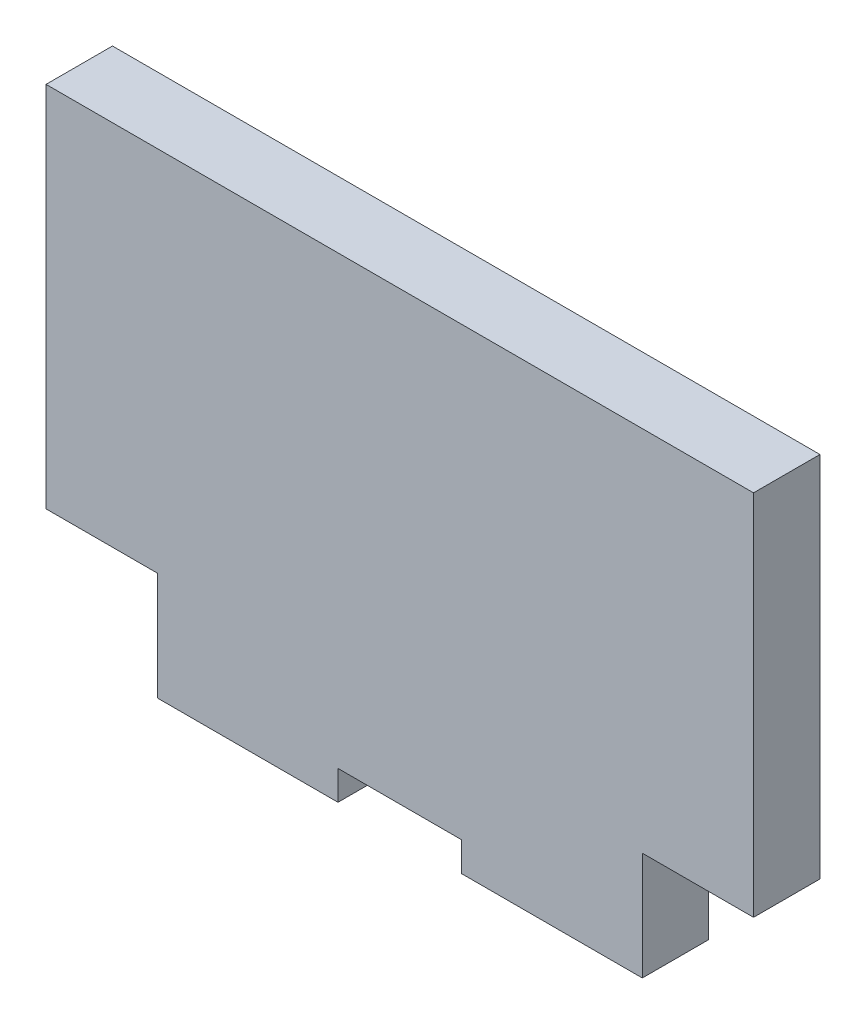
ISO-10303-21;
HEADER;
FILE_DESCRIPTION(('STEP AP214'),'2;1');
FILE_NAME('part.step','',(''),(''),'','','');
FILE_SCHEMA(('AUTOMOTIVE_DESIGN { 1 0 10303 214 1 1 1 1 }'));
ENDSEC;
DATA;
#1=APPLICATION_CONTEXT('core data for automotive mechanical design processes');
#2=APPLICATION_PROTOCOL_DEFINITION('international standard','automotive_design',2000,#1);
#3=PRODUCT_CONTEXT('',#1,'mechanical');
#4=PRODUCT('Part','Part','',(#3));
#5=PRODUCT_RELATED_PRODUCT_CATEGORY('part','',(#4));
#6=PRODUCT_DEFINITION_FORMATION('','',#4);
#7=PRODUCT_DEFINITION_CONTEXT('part definition',#1,'design');
#8=PRODUCT_DEFINITION('design','',#6,#7);
#9=PRODUCT_DEFINITION_SHAPE('','',#8);
#10=(LENGTH_UNIT() NAMED_UNIT(*) SI_UNIT(.MILLI.,.METRE.));
#11=(NAMED_UNIT(*) PLANE_ANGLE_UNIT() SI_UNIT($,.RADIAN.));
#12=(NAMED_UNIT(*) SI_UNIT($,.STERADIAN.) SOLID_ANGLE_UNIT());
#13=UNCERTAINTY_MEASURE_WITH_UNIT(LENGTH_MEASURE(1.E-05),#10,'distance_accuracy_value','');
#14=(GEOMETRIC_REPRESENTATION_CONTEXT(3) GLOBAL_UNCERTAINTY_ASSIGNED_CONTEXT((#13)) GLOBAL_UNIT_ASSIGNED_CONTEXT((#10,
#11,#12)) REPRESENTATION_CONTEXT('',''));
#15=CARTESIAN_POINT('',(0.,0.,0.));
#16=DIRECTION('',(0.,0.,1.));
#17=DIRECTION('',(1.,0.,0.));
#18=AXIS2_PLACEMENT_3D('',#15,#16,#17);
#19=CARTESIAN_POINT('',(-4.,-13.5,-4.3));
#20=DIRECTION('',(0.,1.,0.));
#21=DIRECTION('',(0.,0.,1.));
#22=AXIS2_PLACEMENT_3D('',#19,#20,#21);
#23=PLANE('',#22);
#24=DIRECTION('',(-1.,0.,0.));
#25=VECTOR('',#24,1.);
#26=CARTESIAN_POINT('',(5.5,-13.5,-1.));
#27=LINE('',#26,#25);
#28=CARTESIAN_POINT('',(4.,-13.5,-1.));
#29=VERTEX_POINT('',#28);
#30=CARTESIAN_POINT('',(-4.,-13.5,-1.));
#31=VERTEX_POINT('',#30);
#32=EDGE_CURVE('E443',#29,#31,#27,.T.);
#33=ORIENTED_EDGE('',*,*,#32,.F.);
#34=DIRECTION('',(0.,0.,1.));
#35=VECTOR('',#34,1.);
#36=CARTESIAN_POINT('',(4.,-13.5,-4.3));
#37=LINE('',#36,#35);
#38=CARTESIAN_POINT('',(4.,-13.5,0.));
#39=VERTEX_POINT('',#38);
#40=EDGE_CURVE('E195',#29,#39,#37,.T.);
#41=ORIENTED_EDGE('',*,*,#40,.T.);
#42=DIRECTION('',(-1.,0.,0.));
#43=VECTOR('',#42,1.);
#44=CARTESIAN_POINT('',(-4.,-13.5,0.));
#45=LINE('',#44,#43);
#46=CARTESIAN_POINT('',(-4.,-13.5,0.));
#47=VERTEX_POINT('',#46);
#48=EDGE_CURVE('E189',#39,#47,#45,.T.);
#49=ORIENTED_EDGE('',*,*,#48,.T.);
#50=DIRECTION('',(0.,0.,1.));
#51=VECTOR('',#50,1.);
#52=CARTESIAN_POINT('',(-4.,-13.5,-4.3));
#53=LINE('',#52,#51);
#54=EDGE_CURVE('E469',#31,#47,#53,.T.);
#55=ORIENTED_EDGE('',*,*,#54,.F.);
#56=EDGE_LOOP('',(#33,#41,#49,#55));
#57=FACE_BOUND('',#56,.T.);
#58=ADVANCED_FACE('F33',(#57),#23,.F.);
#59=CARTESIAN_POINT('',(4.,-15.4,-4.3));
#60=DIRECTION('',(0.,-1.,0.));
#61=DIRECTION('',(0.,0.,-1.));
#62=AXIS2_PLACEMENT_3D('',#59,#60,#61);
#63=PLANE('',#62);
#64=DIRECTION('',(0.,0.,-1.));
#65=VECTOR('',#64,1.);
#66=CARTESIAN_POINT('',(-4.,-15.4,-4.3));
#67=LINE('',#66,#65);
#68=CARTESIAN_POINT('',(-4.,-15.4,0.));
#69=VERTEX_POINT('',#68);
#70=CARTESIAN_POINT('',(-4.,-15.4,-4.3));
#71=VERTEX_POINT('',#70);
#72=EDGE_CURVE('E150',#69,#71,#67,.T.);
#73=ORIENTED_EDGE('',*,*,#72,.F.);
#74=DIRECTION('',(1.,0.,0.));
#75=VECTOR('',#74,1.);
#76=CARTESIAN_POINT('',(4.,-15.4,0.));
#77=LINE('',#76,#75);
#78=CARTESIAN_POINT('',(-15.7,-15.4,0.));
#79=VERTEX_POINT('',#78);
#80=EDGE_CURVE('E165',#79,#69,#77,.T.);
#81=ORIENTED_EDGE('',*,*,#80,.F.);
#82=DIRECTION('',(0.,0.,1.));
#83=VECTOR('',#82,1.);
#84=CARTESIAN_POINT('',(-15.7,-15.4,-4.3));
#85=LINE('',#84,#83);
#86=CARTESIAN_POINT('',(-15.7,-15.4,-4.3));
#87=VERTEX_POINT('',#86);
#88=EDGE_CURVE('E41',#87,#79,#85,.T.);
#89=ORIENTED_EDGE('',*,*,#88,.F.);
#90=DIRECTION('',(1.,0.,0.));
#91=VECTOR('',#90,1.);
#92=CARTESIAN_POINT('',(15.7,-15.4,-4.3));
#93=LINE('',#92,#91);
#94=EDGE_CURVE('E56',#87,#71,#93,.T.);
#95=ORIENTED_EDGE('',*,*,#94,.T.);
#96=EDGE_LOOP('',(#73,#81,#89,#95));
#97=FACE_BOUND('',#96,.T.);
#98=ADVANCED_FACE('F228',(#97),#63,.T.);
#99=DIRECTION('',(0.,0.,1.));
#100=VECTOR('',#99,1.);
#101=CARTESIAN_POINT('',(4.,-15.4,-4.3));
#102=LINE('',#101,#100);
#103=CARTESIAN_POINT('',(4.,-15.4,-4.3));
#104=VERTEX_POINT('',#103);
#105=CARTESIAN_POINT('',(4.,-15.4,0.));
#106=VERTEX_POINT('',#105);
#107=EDGE_CURVE('E48',#104,#106,#102,.T.);
#108=ORIENTED_EDGE('',*,*,#107,.F.);
#109=CARTESIAN_POINT('',(15.7,-15.4,-4.3));
#110=VERTEX_POINT('',#109);
#111=EDGE_CURVE('E97',#104,#110,#93,.T.);
#112=ORIENTED_EDGE('',*,*,#111,.T.);
#113=DIRECTION('',(0.,0.,1.));
#114=VECTOR('',#113,1.);
#115=CARTESIAN_POINT('',(15.7,-15.4,-4.3));
#116=LINE('',#115,#114);
#117=CARTESIAN_POINT('',(15.7,-15.4,0.));
#118=VERTEX_POINT('',#117);
#119=EDGE_CURVE('E145',#110,#118,#116,.T.);
#120=ORIENTED_EDGE('',*,*,#119,.T.);
#121=EDGE_CURVE('E164',#106,#118,#77,.T.);
#122=ORIENTED_EDGE('',*,*,#121,.F.);
#123=EDGE_LOOP('',(#108,#112,#120,#122));
#124=FACE_BOUND('',#123,.T.);
#125=ADVANCED_FACE('F178',(#124),#63,.T.);
#126=CARTESIAN_POINT('',(-15.7,-15.4,-4.3));
#127=DIRECTION('',(-1.,0.,0.));
#128=DIRECTION('',(0.,0.,1.));
#129=AXIS2_PLACEMENT_3D('',#126,#127,#128);
#130=PLANE('',#129);
#131=DIRECTION('',(0.,-1.,0.));
#132=VECTOR('',#131,1.);
#133=CARTESIAN_POINT('',(-15.7,-15.4,0.));
#134=LINE('',#133,#132);
#135=CARTESIAN_POINT('',(-15.7,-8.4,0.));
#136=VERTEX_POINT('',#135);
#137=EDGE_CURVE('E162',#136,#79,#134,.T.);
#138=ORIENTED_EDGE('',*,*,#137,.F.);
#139=DIRECTION('',(0.,0.,1.));
#140=VECTOR('',#139,1.);
#141=CARTESIAN_POINT('',(-15.7,-8.4,-4.3));
#142=LINE('',#141,#140);
#143=CARTESIAN_POINT('',(-15.7,-8.4,-4.3));
#144=VERTEX_POINT('',#143);
#145=EDGE_CURVE('E126',#144,#136,#142,.T.);
#146=ORIENTED_EDGE('',*,*,#145,.F.);
#147=DIRECTION('',(0.,-1.,0.));
#148=VECTOR('',#147,1.);
#149=CARTESIAN_POINT('',(-15.7,-15.4,-4.3));
#150=LINE('',#149,#148);
#151=EDGE_CURVE('E135',#144,#87,#150,.T.);
#152=ORIENTED_EDGE('',*,*,#151,.T.);
#153=ORIENTED_EDGE('',*,*,#88,.T.);
#154=EDGE_LOOP('',(#138,#146,#152,#153));
#155=FACE_BOUND('',#154,.T.);
#156=ADVANCED_FACE('F275',(#155),#130,.T.);
#157=CARTESIAN_POINT('',(-15.7,-8.4,-4.3));
#158=DIRECTION('',(0.,-1.,0.));
#159=DIRECTION('',(0.,0.,-1.));
#160=AXIS2_PLACEMENT_3D('',#157,#158,#159);
#161=PLANE('',#160);
#162=DIRECTION('',(1.,0.,0.));
#163=VECTOR('',#162,1.);
#164=CARTESIAN_POINT('',(-15.7,-8.4,0.));
#165=LINE('',#164,#163);
#166=CARTESIAN_POINT('',(-22.9,-8.4,0.));
#167=VERTEX_POINT('',#166);
#168=EDGE_CURVE('E121',#167,#136,#165,.T.);
#169=ORIENTED_EDGE('',*,*,#168,.F.);
#170=DIRECTION('',(0.,0.,1.));
#171=VECTOR('',#170,1.);
#172=CARTESIAN_POINT('',(-22.9,-8.4,-4.3));
#173=LINE('',#172,#171);
#174=CARTESIAN_POINT('',(-22.9,-8.4,-4.3));
#175=VERTEX_POINT('',#174);
#176=EDGE_CURVE('E116',#175,#167,#173,.T.);
#177=ORIENTED_EDGE('',*,*,#176,.F.);
#178=DIRECTION('',(1.,0.,0.));
#179=VECTOR('',#178,1.);
#180=CARTESIAN_POINT('',(-15.7,-8.4,-4.3));
#181=LINE('',#180,#179);
#182=EDGE_CURVE('E119',#175,#144,#181,.T.);
#183=ORIENTED_EDGE('',*,*,#182,.T.);
#184=ORIENTED_EDGE('',*,*,#145,.T.);
#185=EDGE_LOOP('',(#169,#177,#183,#184));
#186=FACE_BOUND('',#185,.T.);
#187=ADVANCED_FACE('F118',(#186),#161,.T.);
#188=CARTESIAN_POINT('',(-22.9,-8.4,-4.3));
#189=DIRECTION('',(-1.,0.,0.));
#190=DIRECTION('',(0.,0.,1.));
#191=AXIS2_PLACEMENT_3D('',#188,#189,#190);
#192=PLANE('',#191);
#193=DIRECTION('',(0.,-1.,0.));
#194=VECTOR('',#193,1.);
#195=CARTESIAN_POINT('',(-22.9,-8.4,0.));
#196=LINE('',#195,#194);
#197=CARTESIAN_POINT('',(-22.9,15.4,0.));
#198=VERTEX_POINT('',#197);
#199=EDGE_CURVE('E159',#198,#167,#196,.T.);
#200=ORIENTED_EDGE('',*,*,#199,.F.);
#201=DIRECTION('',(0.,0.,1.));
#202=VECTOR('',#201,1.);
#203=CARTESIAN_POINT('',(-22.9,15.4,-4.3));
#204=LINE('',#203,#202);
#205=CARTESIAN_POINT('',(-22.9,15.4,-4.3));
#206=VERTEX_POINT('',#205);
#207=EDGE_CURVE('E127',#206,#198,#204,.T.);
#208=ORIENTED_EDGE('',*,*,#207,.F.);
#209=DIRECTION('',(0.,-1.,0.));
#210=VECTOR('',#209,1.);
#211=CARTESIAN_POINT('',(-22.9,-8.4,-4.3));
#212=LINE('',#211,#210);
#213=EDGE_CURVE('E133',#206,#175,#212,.T.);
#214=ORIENTED_EDGE('',*,*,#213,.T.);
#215=ORIENTED_EDGE('',*,*,#176,.T.);
#216=EDGE_LOOP('',(#200,#208,#214,#215));
#217=FACE_BOUND('',#216,.T.);
#218=ADVANCED_FACE('F137',(#217),#192,.T.);
#219=CARTESIAN_POINT('',(-22.9,15.4,-4.3));
#220=DIRECTION('',(0.,1.,0.));
#221=DIRECTION('',(0.,0.,1.));
#222=AXIS2_PLACEMENT_3D('',#219,#220,#221);
#223=PLANE('',#222);
#224=DIRECTION('',(-1.,0.,0.));
#225=VECTOR('',#224,1.);
#226=CARTESIAN_POINT('',(-22.9,15.4,0.));
#227=LINE('',#226,#225);
#228=CARTESIAN_POINT('',(22.9,15.4,0.));
#229=VERTEX_POINT('',#228);
#230=EDGE_CURVE('E156',#229,#198,#227,.T.);
#231=ORIENTED_EDGE('',*,*,#230,.F.);
#232=DIRECTION('',(0.,0.,1.));
#233=VECTOR('',#232,1.);
#234=CARTESIAN_POINT('',(22.9,15.4,-4.3));
#235=LINE('',#234,#233);
#236=CARTESIAN_POINT('',(22.9,15.4,-4.3));
#237=VERTEX_POINT('',#236);
#238=EDGE_CURVE('E171',#237,#229,#235,.T.);
#239=ORIENTED_EDGE('',*,*,#238,.F.);
#240=DIRECTION('',(-1.,0.,0.));
#241=VECTOR('',#240,1.);
#242=CARTESIAN_POINT('',(-22.9,15.4,-4.3));
#243=LINE('',#242,#241);
#244=EDGE_CURVE('E138',#237,#206,#243,.T.);
#245=ORIENTED_EDGE('',*,*,#244,.T.);
#246=ORIENTED_EDGE('',*,*,#207,.T.);
#247=EDGE_LOOP('',(#231,#239,#245,#246));
#248=FACE_BOUND('',#247,.T.);
#249=ADVANCED_FACE('F246',(#248),#223,.T.);
#250=CARTESIAN_POINT('',(22.9,15.4,-4.3));
#251=DIRECTION('',(1.,0.,0.));
#252=DIRECTION('',(0.,0.,-1.));
#253=AXIS2_PLACEMENT_3D('',#250,#251,#252);
#254=PLANE('',#253);
#255=DIRECTION('',(0.,1.,0.));
#256=VECTOR('',#255,1.);
#257=CARTESIAN_POINT('',(22.9,15.4,0.));
#258=LINE('',#257,#256);
#259=CARTESIAN_POINT('',(22.9,-8.4,0.));
#260=VERTEX_POINT('',#259);
#261=EDGE_CURVE('E153',#260,#229,#258,.T.);
#262=ORIENTED_EDGE('',*,*,#261,.F.);
#263=DIRECTION('',(0.,0.,1.));
#264=VECTOR('',#263,1.);
#265=CARTESIAN_POINT('',(22.9,-8.4,-4.3));
#266=LINE('',#265,#264);
#267=CARTESIAN_POINT('',(22.9,-8.4,-4.3));
#268=VERTEX_POINT('',#267);
#269=EDGE_CURVE('E173',#268,#260,#266,.T.);
#270=ORIENTED_EDGE('',*,*,#269,.F.);
#271=DIRECTION('',(0.,1.,0.));
#272=VECTOR('',#271,1.);
#273=CARTESIAN_POINT('',(22.9,15.4,-4.3));
#274=LINE('',#273,#272);
#275=EDGE_CURVE('E140',#268,#237,#274,.T.);
#276=ORIENTED_EDGE('',*,*,#275,.T.);
#277=ORIENTED_EDGE('',*,*,#238,.T.);
#278=EDGE_LOOP('',(#262,#270,#276,#277));
#279=FACE_BOUND('',#278,.T.);
#280=ADVANCED_FACE('F240',(#279),#254,.T.);
#281=CARTESIAN_POINT('',(22.9,-8.4,-4.3));
#282=DIRECTION('',(0.,-1.,0.));
#283=DIRECTION('',(0.,0.,-1.));
#284=AXIS2_PLACEMENT_3D('',#281,#282,#283);
#285=PLANE('',#284);
#286=DIRECTION('',(1.,0.,0.));
#287=VECTOR('',#286,1.);
#288=CARTESIAN_POINT('',(22.9,-8.4,0.));
#289=LINE('',#288,#287);
#290=CARTESIAN_POINT('',(15.7,-8.4,0.));
#291=VERTEX_POINT('',#290);
#292=EDGE_CURVE('E149',#291,#260,#289,.T.);
#293=ORIENTED_EDGE('',*,*,#292,.F.);
#294=DIRECTION('',(0.,0.,1.));
#295=VECTOR('',#294,1.);
#296=CARTESIAN_POINT('',(15.7,-8.4,-4.3));
#297=LINE('',#296,#295);
#298=CARTESIAN_POINT('',(15.7,-8.4,-4.3));
#299=VERTEX_POINT('',#298);
#300=EDGE_CURVE('E175',#299,#291,#297,.T.);
#301=ORIENTED_EDGE('',*,*,#300,.F.);
#302=DIRECTION('',(1.,0.,0.));
#303=VECTOR('',#302,1.);
#304=CARTESIAN_POINT('',(22.9,-8.4,-4.3));
#305=LINE('',#304,#303);
#306=EDGE_CURVE('E231',#299,#268,#305,.T.);
#307=ORIENTED_EDGE('',*,*,#306,.T.);
#308=ORIENTED_EDGE('',*,*,#269,.T.);
#309=EDGE_LOOP('',(#293,#301,#307,#308));
#310=FACE_BOUND('',#309,.T.);
#311=ADVANCED_FACE('F244',(#310),#285,.T.);
#312=CARTESIAN_POINT('',(15.7,-8.4,-4.3));
#313=DIRECTION('',(1.,0.,0.));
#314=DIRECTION('',(0.,0.,-1.));
#315=AXIS2_PLACEMENT_3D('',#312,#313,#314);
#316=PLANE('',#315);
#317=DIRECTION('',(0.,1.,0.));
#318=VECTOR('',#317,1.);
#319=CARTESIAN_POINT('',(15.7,-8.4,0.));
#320=LINE('',#319,#318);
#321=EDGE_CURVE('E146',#118,#291,#320,.T.);
#322=ORIENTED_EDGE('',*,*,#321,.F.);
#323=ORIENTED_EDGE('',*,*,#119,.F.);
#324=DIRECTION('',(0.,1.,0.));
#325=VECTOR('',#324,1.);
#326=CARTESIAN_POINT('',(15.7,-8.4,-4.3));
#327=LINE('',#326,#325);
#328=EDGE_CURVE('E229',#110,#299,#327,.T.);
#329=ORIENTED_EDGE('',*,*,#328,.T.);
#330=ORIENTED_EDGE('',*,*,#300,.T.);
#331=EDGE_LOOP('',(#322,#323,#329,#330));
#332=FACE_BOUND('',#331,.T.);
#333=ADVANCED_FACE('F35',(#332),#316,.T.);
#334=CARTESIAN_POINT('',(0.,0.,-4.3));
#335=DIRECTION('',(0.,0.,-1.));
#336=DIRECTION('',(-1.,0.,0.));
#337=AXIS2_PLACEMENT_3D('',#334,#335,#336);
#338=PLANE('',#337);
#339=DIRECTION('',(-1.,0.,0.));
#340=VECTOR('',#339,1.);
#341=CARTESIAN_POINT('',(5.5,-13.5,-4.3));
#342=LINE('',#341,#340);
#343=CARTESIAN_POINT('',(-4.,-13.5,-4.3));
#344=VERTEX_POINT('',#343);
#345=CARTESIAN_POINT('',(-5.5,-13.5,-4.3));
#346=VERTEX_POINT('',#345);
#347=EDGE_CURVE('E225',#344,#346,#342,.T.);
#348=ORIENTED_EDGE('',*,*,#347,.F.);
#349=DIRECTION('',(0.,-1.,0.));
#350=VECTOR('',#349,1.);
#351=CARTESIAN_POINT('',(-4.,-15.5,-4.3));
#352=LINE('',#351,#350);
#353=EDGE_CURVE('E219',#344,#71,#352,.T.);
#354=ORIENTED_EDGE('',*,*,#353,.T.);
#355=ORIENTED_EDGE('',*,*,#94,.F.);
#356=ORIENTED_EDGE('',*,*,#151,.F.);
#357=ORIENTED_EDGE('',*,*,#182,.F.);
#358=ORIENTED_EDGE('',*,*,#213,.F.);
#359=ORIENTED_EDGE('',*,*,#244,.F.);
#360=ORIENTED_EDGE('',*,*,#275,.F.);
#361=ORIENTED_EDGE('',*,*,#306,.F.);
#362=ORIENTED_EDGE('',*,*,#328,.F.);
#363=ORIENTED_EDGE('',*,*,#111,.F.);
#364=DIRECTION('',(0.,1.,0.));
#365=VECTOR('',#364,1.);
#366=CARTESIAN_POINT('',(4.,-15.5,-4.3));
#367=LINE('',#366,#365);
#368=CARTESIAN_POINT('',(4.,-13.5,-4.3));
#369=VERTEX_POINT('',#368);
#370=EDGE_CURVE('E226',#104,#369,#367,.T.);
#371=ORIENTED_EDGE('',*,*,#370,.T.);
#372=CARTESIAN_POINT('',(5.5,-13.5,-4.3));
#373=VERTEX_POINT('',#372);
#374=EDGE_CURVE('E431',#373,#369,#342,.T.);
#375=ORIENTED_EDGE('',*,*,#374,.F.);
#376=DIRECTION('',(0.,-1.,0.));
#377=VECTOR('',#376,1.);
#378=CARTESIAN_POINT('',(5.5,-1.50000000000001,-4.3));
#379=LINE('',#378,#377);
#380=CARTESIAN_POINT('',(5.5,-1.50000000000001,-4.3));
#381=VERTEX_POINT('',#380);
#382=EDGE_CURVE('E450',#381,#373,#379,.T.);
#383=ORIENTED_EDGE('',*,*,#382,.F.);
#384=DIRECTION('',(1.,0.,0.));
#385=VECTOR('',#384,1.);
#386=CARTESIAN_POINT('',(5.5,-1.50000000000001,-4.3));
#387=LINE('',#386,#385);
#388=CARTESIAN_POINT('',(-5.5,-1.50000000000001,-4.3));
#389=VERTEX_POINT('',#388);
#390=EDGE_CURVE('E447',#389,#381,#387,.T.);
#391=ORIENTED_EDGE('',*,*,#390,.F.);
#392=DIRECTION('',(0.,1.,0.));
#393=VECTOR('',#392,1.);
#394=CARTESIAN_POINT('',(-5.5,-1.50000000000001,-4.3));
#395=LINE('',#394,#393);
#396=EDGE_CURVE('E444',#346,#389,#395,.T.);
#397=ORIENTED_EDGE('',*,*,#396,.F.);
#398=EDGE_LOOP('',(#348,#354,#355,#356,#357,#358,#359,#360,#361,#362,#363,#371,#375,#383,#391,#397));
#399=FACE_BOUND('',#398,.T.);
#400=ADVANCED_FACE('F131',(#399),#338,.T.);
#401=CARTESIAN_POINT('',(0.,0.,0.));
#402=DIRECTION('',(0.,0.,-1.));
#403=DIRECTION('',(-1.,0.,0.));
#404=AXIS2_PLACEMENT_3D('',#401,#402,#403);
#405=PLANE('',#404);
#406=ORIENTED_EDGE('',*,*,#80,.T.);
#407=DIRECTION('',(0.,-1.,0.));
#408=VECTOR('',#407,1.);
#409=CARTESIAN_POINT('',(-4.,-15.5,0.));
#410=LINE('',#409,#408);
#411=EDGE_CURVE('E213',#47,#69,#410,.T.);
#412=ORIENTED_EDGE('',*,*,#411,.F.);
#413=ORIENTED_EDGE('',*,*,#48,.F.);
#414=DIRECTION('',(0.,-1.,0.));
#415=VECTOR('',#414,1.);
#416=CARTESIAN_POINT('',(4.,0.,0.));
#417=LINE('',#416,#415);
#418=EDGE_CURVE('E11',#39,#106,#417,.T.);
#419=ORIENTED_EDGE('',*,*,#418,.T.);
#420=ORIENTED_EDGE('',*,*,#121,.T.);
#421=ORIENTED_EDGE('',*,*,#321,.T.);
#422=ORIENTED_EDGE('',*,*,#292,.T.);
#423=ORIENTED_EDGE('',*,*,#261,.T.);
#424=ORIENTED_EDGE('',*,*,#230,.T.);
#425=ORIENTED_EDGE('',*,*,#199,.T.);
#426=ORIENTED_EDGE('',*,*,#168,.T.);
#427=ORIENTED_EDGE('',*,*,#137,.T.);
#428=EDGE_LOOP('',(#406,#412,#413,#419,#420,#421,#422,#423,#424,#425,#426,#427));
#429=FACE_BOUND('',#428,.T.);
#430=ADVANCED_FACE('F184',(#429),#405,.F.);
#431=CARTESIAN_POINT('',(-4.,-15.5,-4.3));
#432=DIRECTION('',(-1.,0.,0.));
#433=DIRECTION('',(0.,0.,1.));
#434=AXIS2_PLACEMENT_3D('',#431,#432,#433);
#435=PLANE('',#434);
#436=ORIENTED_EDGE('',*,*,#72,.T.);
#437=ORIENTED_EDGE('',*,*,#353,.F.);
#438=EDGE_CURVE('E467',#344,#31,#53,.T.);
#439=ORIENTED_EDGE('',*,*,#438,.T.);
#440=ORIENTED_EDGE('',*,*,#54,.T.);
#441=ORIENTED_EDGE('',*,*,#411,.T.);
#442=EDGE_LOOP('',(#436,#437,#439,#440,#441));
#443=FACE_BOUND('',#442,.T.);
#444=ADVANCED_FACE('F216',(#443),#435,.F.);
#445=CARTESIAN_POINT('',(4.,-15.5,-4.3));
#446=DIRECTION('',(1.,0.,0.));
#447=DIRECTION('',(0.,0.,-1.));
#448=AXIS2_PLACEMENT_3D('',#445,#446,#447);
#449=PLANE('',#448);
#450=ORIENTED_EDGE('',*,*,#107,.T.);
#451=ORIENTED_EDGE('',*,*,#418,.F.);
#452=ORIENTED_EDGE('',*,*,#40,.F.);
#453=EDGE_CURVE('E470',#369,#29,#37,.T.);
#454=ORIENTED_EDGE('',*,*,#453,.F.);
#455=ORIENTED_EDGE('',*,*,#370,.F.);
#456=EDGE_LOOP('',(#450,#451,#452,#454,#455));
#457=FACE_BOUND('',#456,.T.);
#458=ADVANCED_FACE('F191',(#457),#449,.F.);
#459=CARTESIAN_POINT('',(5.5,-13.5,-1.));
#460=DIRECTION('',(0.,-1.,0.));
#461=DIRECTION('',(0.,0.,-1.));
#462=AXIS2_PLACEMENT_3D('',#459,#460,#461);
#463=PLANE('',#462);
#464=ORIENTED_EDGE('',*,*,#347,.T.);
#465=DIRECTION('',(0.,0.,-1.));
#466=VECTOR('',#465,1.);
#467=CARTESIAN_POINT('',(-5.5,-13.5,-1.));
#468=LINE('',#467,#466);
#469=CARTESIAN_POINT('',(-5.5,-13.5,-1.));
#470=VERTEX_POINT('',#469);
#471=EDGE_CURVE('E453',#470,#346,#468,.T.);
#472=ORIENTED_EDGE('',*,*,#471,.F.);
#473=EDGE_CURVE('E425',#31,#470,#27,.T.);
#474=ORIENTED_EDGE('',*,*,#473,.F.);
#475=ORIENTED_EDGE('',*,*,#438,.F.);
#476=EDGE_LOOP('',(#464,#472,#474,#475));
#477=FACE_BOUND('',#476,.T.);
#478=ADVANCED_FACE('F267',(#477),#463,.F.);
#479=CARTESIAN_POINT('',(5.5,-13.5,-1.));
#480=VERTEX_POINT('',#479);
#481=EDGE_CURVE('E439',#480,#29,#27,.T.);
#482=ORIENTED_EDGE('',*,*,#481,.F.);
#483=DIRECTION('',(0.,0.,-1.));
#484=VECTOR('',#483,1.);
#485=CARTESIAN_POINT('',(5.5,-13.5,-1.));
#486=LINE('',#485,#484);
#487=EDGE_CURVE('E455',#480,#373,#486,.T.);
#488=ORIENTED_EDGE('',*,*,#487,.T.);
#489=ORIENTED_EDGE('',*,*,#374,.T.);
#490=ORIENTED_EDGE('',*,*,#453,.T.);
#491=EDGE_LOOP('',(#482,#488,#489,#490));
#492=FACE_BOUND('',#491,.T.);
#493=ADVANCED_FACE('F363',(#492),#463,.F.);
#494=CARTESIAN_POINT('',(-5.5,-1.50000000000001,-1.));
#495=DIRECTION('',(-1.,0.,0.));
#496=DIRECTION('',(0.,-1.,0.));
#497=AXIS2_PLACEMENT_3D('',#494,#495,#496);
#498=PLANE('',#497);
#499=ORIENTED_EDGE('',*,*,#396,.T.);
#500=DIRECTION('',(0.,0.,-1.));
#501=VECTOR('',#500,1.);
#502=CARTESIAN_POINT('',(-5.5,-1.50000000000001,-1.));
#503=LINE('',#502,#501);
#504=CARTESIAN_POINT('',(-5.5,-1.50000000000001,-1.));
#505=VERTEX_POINT('',#504);
#506=EDGE_CURVE('E442',#505,#389,#503,.T.);
#507=ORIENTED_EDGE('',*,*,#506,.F.);
#508=DIRECTION('',(0.,1.,0.));
#509=VECTOR('',#508,1.);
#510=CARTESIAN_POINT('',(-5.5,-1.50000000000001,-1.));
#511=LINE('',#510,#509);
#512=EDGE_CURVE('E418',#470,#505,#511,.T.);
#513=ORIENTED_EDGE('',*,*,#512,.F.);
#514=ORIENTED_EDGE('',*,*,#471,.T.);
#515=EDGE_LOOP('',(#499,#507,#513,#514));
#516=FACE_BOUND('',#515,.T.);
#517=ADVANCED_FACE('F263',(#516),#498,.F.);
#518=CARTESIAN_POINT('',(5.5,-1.50000000000001,-1.));
#519=DIRECTION('',(1.,0.,0.));
#520=DIRECTION('',(0.,1.,0.));
#521=AXIS2_PLACEMENT_3D('',#518,#519,#520);
#522=PLANE('',#521);
#523=ORIENTED_EDGE('',*,*,#382,.T.);
#524=ORIENTED_EDGE('',*,*,#487,.F.);
#525=DIRECTION('',(0.,-1.,0.));
#526=VECTOR('',#525,1.);
#527=CARTESIAN_POINT('',(5.5,-1.50000000000001,-1.));
#528=LINE('',#527,#526);
#529=CARTESIAN_POINT('',(5.5,-1.50000000000001,-1.));
#530=VERTEX_POINT('',#529);
#531=EDGE_CURVE('E433',#530,#480,#528,.T.);
#532=ORIENTED_EDGE('',*,*,#531,.F.);
#533=DIRECTION('',(0.,0.,-1.));
#534=VECTOR('',#533,1.);
#535=CARTESIAN_POINT('',(5.5,-1.50000000000001,-1.));
#536=LINE('',#535,#534);
#537=EDGE_CURVE('E458',#530,#381,#536,.T.);
#538=ORIENTED_EDGE('',*,*,#537,.T.);
#539=EDGE_LOOP('',(#523,#524,#532,#538));
#540=FACE_BOUND('',#539,.T.);
#541=ADVANCED_FACE('F381',(#540),#522,.F.);
#542=CARTESIAN_POINT('',(5.5,-1.50000000000001,-1.));
#543=DIRECTION('',(0.,1.,0.));
#544=DIRECTION('',(0.,0.,1.));
#545=AXIS2_PLACEMENT_3D('',#542,#543,#544);
#546=PLANE('',#545);
#547=ORIENTED_EDGE('',*,*,#390,.T.);
#548=ORIENTED_EDGE('',*,*,#537,.F.);
#549=DIRECTION('',(1.,0.,0.));
#550=VECTOR('',#549,1.);
#551=CARTESIAN_POINT('',(5.5,-1.50000000000001,-1.));
#552=LINE('',#551,#550);
#553=EDGE_CURVE('E422',#505,#530,#552,.T.);
#554=ORIENTED_EDGE('',*,*,#553,.F.);
#555=ORIENTED_EDGE('',*,*,#506,.T.);
#556=EDGE_LOOP('',(#547,#548,#554,#555));
#557=FACE_BOUND('',#556,.T.);
#558=ADVANCED_FACE('F390',(#557),#546,.F.);
#559=CARTESIAN_POINT('',(0.,0.,-1.));
#560=DIRECTION('',(0.,0.,-1.));
#561=DIRECTION('',(-1.,0.,0.));
#562=AXIS2_PLACEMENT_3D('',#559,#560,#561);
#563=PLANE('',#562);
#564=ORIENTED_EDGE('',*,*,#512,.T.);
#565=ORIENTED_EDGE('',*,*,#553,.T.);
#566=ORIENTED_EDGE('',*,*,#531,.T.);
#567=ORIENTED_EDGE('',*,*,#481,.T.);
#568=ORIENTED_EDGE('',*,*,#32,.T.);
#569=ORIENTED_EDGE('',*,*,#473,.T.);
#570=EDGE_LOOP('',(#564,#565,#566,#567,#568,#569));
#571=FACE_BOUND('',#570,.T.);
#572=ADVANCED_FACE('F400',(#571),#563,.T.);
#573=CLOSED_SHELL('',(#58,#98,#125,#156,#187,#218,#249,#280,#311,#333,#400,#430,#444,#458,#478,
#493,#517,#541,#558,#572));
#574=MANIFOLD_SOLID_BREP('B2',#573);
#575=ADVANCED_BREP_SHAPE_REPRESENTATION('',(#18,#574),#14);
#576=SHAPE_DEFINITION_REPRESENTATION(#9,#575);
ENDSEC;
END-ISO-10303-21;
